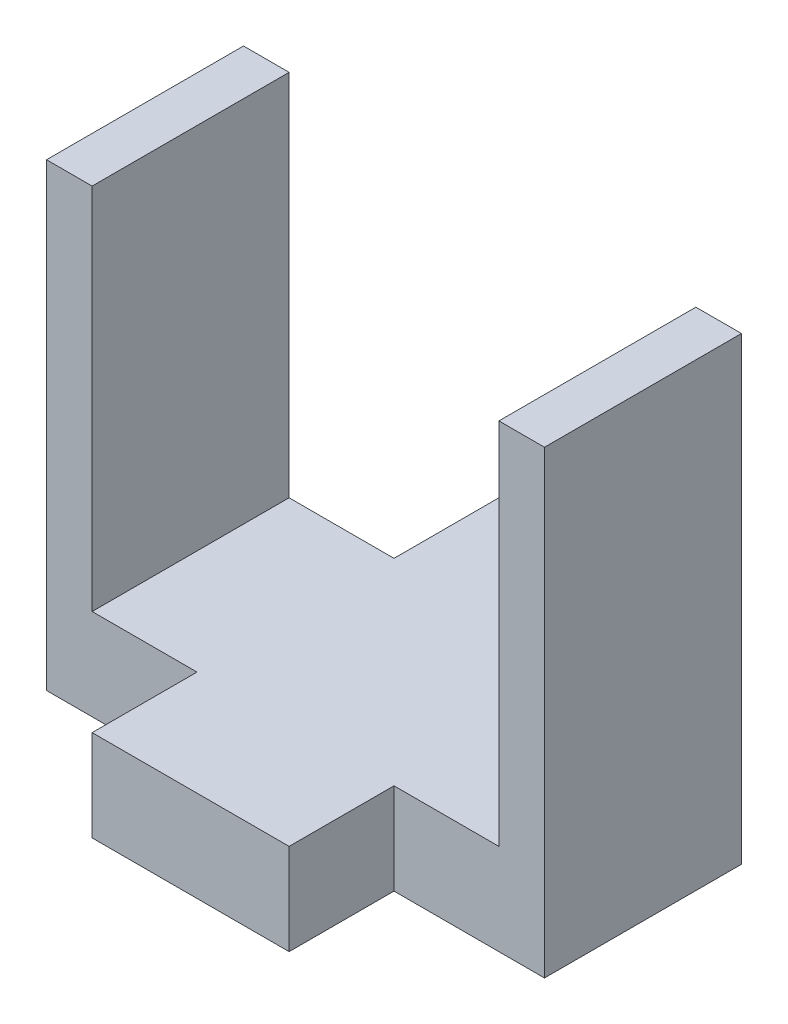
ISO-10303-21;
HEADER;
FILE_DESCRIPTION(('STEP AP214'),'2;1');
FILE_NAME('part.step','',(''),(''),'','','');
FILE_SCHEMA(('AUTOMOTIVE_DESIGN { 1 0 10303 214 1 1 1 1 }'));
ENDSEC;
DATA;
#1=APPLICATION_CONTEXT('core data for automotive mechanical design processes');
#2=APPLICATION_PROTOCOL_DEFINITION('international standard','automotive_design',2000,#1);
#3=PRODUCT_CONTEXT('',#1,'mechanical');
#4=PRODUCT('Part','Part','',(#3));
#5=PRODUCT_RELATED_PRODUCT_CATEGORY('part','',(#4));
#6=PRODUCT_DEFINITION_FORMATION('','',#4);
#7=PRODUCT_DEFINITION_CONTEXT('part definition',#1,'design');
#8=PRODUCT_DEFINITION('design','',#6,#7);
#9=PRODUCT_DEFINITION_SHAPE('','',#8);
#10=(LENGTH_UNIT() NAMED_UNIT(*) SI_UNIT(.MILLI.,.METRE.));
#11=(NAMED_UNIT(*) PLANE_ANGLE_UNIT() SI_UNIT($,.RADIAN.));
#12=(NAMED_UNIT(*) SI_UNIT($,.STERADIAN.) SOLID_ANGLE_UNIT());
#13=UNCERTAINTY_MEASURE_WITH_UNIT(LENGTH_MEASURE(1.E-05),#10,'distance_accuracy_value','');
#14=(GEOMETRIC_REPRESENTATION_CONTEXT(3) GLOBAL_UNCERTAINTY_ASSIGNED_CONTEXT((#13)) GLOBAL_UNIT_ASSIGNED_CONTEXT((#10,
#11,#12)) REPRESENTATION_CONTEXT('',''));
#15=CARTESIAN_POINT('',(0.,0.,0.));
#16=DIRECTION('',(0.,0.,1.));
#17=DIRECTION('',(1.,0.,0.));
#18=AXIS2_PLACEMENT_3D('',#15,#16,#17);
#19=CARTESIAN_POINT('',(10.8,10.,-10.8));
#20=DIRECTION('',(0.,0.,1.));
#21=DIRECTION('',(1.,0.,0.));
#22=AXIS2_PLACEMENT_3D('',#19,#20,#21);
#23=PLANE('',#22);
#24=DIRECTION('',(-1.,0.,0.));
#25=VECTOR('',#24,1.);
#26=CARTESIAN_POINT('',(10.8,0.,-10.8));
#27=LINE('',#26,#25);
#28=CARTESIAN_POINT('',(27.3,0.,-10.8));
#29=VERTEX_POINT('',#28);
#30=CARTESIAN_POINT('',(10.8,0.,-10.8));
#31=VERTEX_POINT('',#30);
#32=EDGE_CURVE('E147',#29,#31,#27,.T.);
#33=ORIENTED_EDGE('',*,*,#32,.T.);
#34=DIRECTION('',(0.,-1.,0.));
#35=VECTOR('',#34,1.);
#36=CARTESIAN_POINT('',(10.8,10.,-10.8));
#37=LINE('',#36,#35);
#38=CARTESIAN_POINT('',(10.8,10.,-10.8));
#39=VERTEX_POINT('',#38);
#40=EDGE_CURVE('E11',#39,#31,#37,.T.);
#41=ORIENTED_EDGE('',*,*,#40,.F.);
#42=DIRECTION('',(-1.,0.,0.));
#43=VECTOR('',#42,1.);
#44=CARTESIAN_POINT('',(10.8,10.,-10.8));
#45=LINE('',#44,#43);
#46=CARTESIAN_POINT('',(22.3,10.,-10.8));
#47=VERTEX_POINT('',#46);
#48=EDGE_CURVE('E168',#47,#39,#45,.T.);
#49=ORIENTED_EDGE('',*,*,#48,.F.);
#50=DIRECTION('',(0.,-1.,0.));
#51=VECTOR('',#50,1.);
#52=CARTESIAN_POINT('',(22.3,50.4,-10.8));
#53=LINE('',#52,#51);
#54=CARTESIAN_POINT('',(22.3,50.4,-10.8));
#55=VERTEX_POINT('',#54);
#56=EDGE_CURVE('E55',#55,#47,#53,.T.);
#57=ORIENTED_EDGE('',*,*,#56,.F.);
#58=DIRECTION('',(-1.,0.,0.));
#59=VECTOR('',#58,1.);
#60=CARTESIAN_POINT('',(22.3,50.4,-10.8));
#61=LINE('',#60,#59);
#62=CARTESIAN_POINT('',(27.3,50.4,-10.8));
#63=VERTEX_POINT('',#62);
#64=EDGE_CURVE('E334',#63,#55,#61,.T.);
#65=ORIENTED_EDGE('',*,*,#64,.F.);
#66=DIRECTION('',(0.,-1.,0.));
#67=VECTOR('',#66,1.);
#68=CARTESIAN_POINT('',(27.3,50.4,-10.8));
#69=LINE('',#68,#67);
#70=EDGE_CURVE('E251',#63,#29,#69,.T.);
#71=ORIENTED_EDGE('',*,*,#70,.T.);
#72=EDGE_LOOP('',(#33,#41,#49,#57,#65,#71));
#73=FACE_BOUND('',#72,.T.);
#74=ADVANCED_FACE('F39',(#73),#23,.F.);
#75=CARTESIAN_POINT('',(10.8,10.,-22.3));
#76=DIRECTION('',(-1.,0.,0.));
#77=DIRECTION('',(0.,0.,1.));
#78=AXIS2_PLACEMENT_3D('',#75,#76,#77);
#79=PLANE('',#78);
#80=DIRECTION('',(0.,0.,-1.));
#81=VECTOR('',#80,1.);
#82=CARTESIAN_POINT('',(10.8,0.,-22.3));
#83=LINE('',#82,#81);
#84=CARTESIAN_POINT('',(10.8,0.,-22.3));
#85=VERTEX_POINT('',#84);
#86=EDGE_CURVE('E150',#31,#85,#83,.T.);
#87=ORIENTED_EDGE('',*,*,#86,.T.);
#88=DIRECTION('',(0.,-1.,0.));
#89=VECTOR('',#88,1.);
#90=CARTESIAN_POINT('',(10.8,10.,-22.3));
#91=LINE('',#90,#89);
#92=CARTESIAN_POINT('',(10.8,10.,-22.3));
#93=VERTEX_POINT('',#92);
#94=EDGE_CURVE('E47',#93,#85,#91,.T.);
#95=ORIENTED_EDGE('',*,*,#94,.F.);
#96=DIRECTION('',(0.,0.,-1.));
#97=VECTOR('',#96,1.);
#98=CARTESIAN_POINT('',(10.8,10.,-22.3));
#99=LINE('',#98,#97);
#100=EDGE_CURVE('E101',#39,#93,#99,.T.);
#101=ORIENTED_EDGE('',*,*,#100,.F.);
#102=ORIENTED_EDGE('',*,*,#40,.T.);
#103=EDGE_LOOP('',(#87,#95,#101,#102));
#104=FACE_BOUND('',#103,.T.);
#105=ADVANCED_FACE('F263',(#104),#79,.F.);
#106=CARTESIAN_POINT('',(-10.8,10.,-22.3));
#107=DIRECTION('',(0.,0.,1.));
#108=DIRECTION('',(1.,0.,0.));
#109=AXIS2_PLACEMENT_3D('',#106,#107,#108);
#110=PLANE('',#109);
#111=DIRECTION('',(-1.,0.,0.));
#112=VECTOR('',#111,1.);
#113=CARTESIAN_POINT('',(-10.8,0.,-22.3));
#114=LINE('',#113,#112);
#115=CARTESIAN_POINT('',(-10.8,0.,-22.3));
#116=VERTEX_POINT('',#115);
#117=EDGE_CURVE('E152',#85,#116,#114,.T.);
#118=ORIENTED_EDGE('',*,*,#117,.T.);
#119=DIRECTION('',(0.,-1.,0.));
#120=VECTOR('',#119,1.);
#121=CARTESIAN_POINT('',(-10.8,10.,-22.3));
#122=LINE('',#121,#120);
#123=CARTESIAN_POINT('',(-10.8,10.,-22.3));
#124=VERTEX_POINT('',#123);
#125=EDGE_CURVE('E177',#124,#116,#122,.T.);
#126=ORIENTED_EDGE('',*,*,#125,.F.);
#127=DIRECTION('',(-1.,0.,0.));
#128=VECTOR('',#127,1.);
#129=CARTESIAN_POINT('',(-10.8,10.,-22.3));
#130=LINE('',#129,#128);
#131=EDGE_CURVE('E185',#93,#124,#130,.T.);
#132=ORIENTED_EDGE('',*,*,#131,.F.);
#133=ORIENTED_EDGE('',*,*,#94,.T.);
#134=EDGE_LOOP('',(#118,#126,#132,#133));
#135=FACE_BOUND('',#134,.T.);
#136=ADVANCED_FACE('F183',(#135),#110,.F.);
#137=CARTESIAN_POINT('',(-10.8,10.,-22.3));
#138=DIRECTION('',(1.,0.,0.));
#139=DIRECTION('',(0.,0.,-1.));
#140=AXIS2_PLACEMENT_3D('',#137,#138,#139);
#141=PLANE('',#140);
#142=DIRECTION('',(0.,0.,1.));
#143=VECTOR('',#142,1.);
#144=CARTESIAN_POINT('',(-10.8,0.,-22.3));
#145=LINE('',#144,#143);
#146=CARTESIAN_POINT('',(-10.8,0.,-10.8));
#147=VERTEX_POINT('',#146);
#148=EDGE_CURVE('E154',#116,#147,#145,.T.);
#149=ORIENTED_EDGE('',*,*,#148,.T.);
#150=DIRECTION('',(0.,-1.,0.));
#151=VECTOR('',#150,1.);
#152=CARTESIAN_POINT('',(-10.8,10.,-10.8));
#153=LINE('',#152,#151);
#154=CARTESIAN_POINT('',(-10.8,10.,-10.8));
#155=VERTEX_POINT('',#154);
#156=EDGE_CURVE('E174',#155,#147,#153,.T.);
#157=ORIENTED_EDGE('',*,*,#156,.F.);
#158=DIRECTION('',(0.,0.,1.));
#159=VECTOR('',#158,1.);
#160=CARTESIAN_POINT('',(-10.8,10.,-22.3));
#161=LINE('',#160,#159);
#162=EDGE_CURVE('E211',#124,#155,#161,.T.);
#163=ORIENTED_EDGE('',*,*,#162,.F.);
#164=ORIENTED_EDGE('',*,*,#125,.T.);
#165=EDGE_LOOP('',(#149,#157,#163,#164));
#166=FACE_BOUND('',#165,.T.);
#167=ADVANCED_FACE('F194',(#166),#141,.F.);
#168=CARTESIAN_POINT('',(-10.8,10.,-10.8));
#169=DIRECTION('',(0.,0.,1.));
#170=DIRECTION('',(1.,0.,0.));
#171=AXIS2_PLACEMENT_3D('',#168,#169,#170);
#172=PLANE('',#171);
#173=DIRECTION('',(-1.,0.,0.));
#174=VECTOR('',#173,1.);
#175=CARTESIAN_POINT('',(-10.8,0.,-10.8));
#176=LINE('',#175,#174);
#177=CARTESIAN_POINT('',(-27.3,0.,-10.8));
#178=VERTEX_POINT('',#177);
#179=EDGE_CURVE('E156',#147,#178,#176,.T.);
#180=ORIENTED_EDGE('',*,*,#179,.T.);
#181=DIRECTION('',(0.,-1.,0.));
#182=VECTOR('',#181,1.);
#183=CARTESIAN_POINT('',(-27.3,50.4,-10.8));
#184=LINE('',#183,#182);
#185=CARTESIAN_POINT('',(-27.3,50.4,-10.8));
#186=VERTEX_POINT('',#185);
#187=EDGE_CURVE('E358',#186,#178,#184,.T.);
#188=ORIENTED_EDGE('',*,*,#187,.F.);
#189=DIRECTION('',(-1.,0.,0.));
#190=VECTOR('',#189,1.);
#191=CARTESIAN_POINT('',(-22.3,50.4,-10.8));
#192=LINE('',#191,#190);
#193=CARTESIAN_POINT('',(-22.3,50.4,-10.8));
#194=VERTEX_POINT('',#193);
#195=EDGE_CURVE('E343',#194,#186,#192,.T.);
#196=ORIENTED_EDGE('',*,*,#195,.F.);
#197=DIRECTION('',(0.,-1.,0.));
#198=VECTOR('',#197,1.);
#199=CARTESIAN_POINT('',(-22.3,50.4,-10.8));
#200=LINE('',#199,#198);
#201=CARTESIAN_POINT('',(-22.3,10.,-10.8));
#202=VERTEX_POINT('',#201);
#203=EDGE_CURVE('E208',#194,#202,#200,.T.);
#204=ORIENTED_EDGE('',*,*,#203,.T.);
#205=DIRECTION('',(-1.,0.,0.));
#206=VECTOR('',#205,1.);
#207=CARTESIAN_POINT('',(-10.8,10.,-10.8));
#208=LINE('',#207,#206);
#209=EDGE_CURVE('E204',#155,#202,#208,.T.);
#210=ORIENTED_EDGE('',*,*,#209,.F.);
#211=ORIENTED_EDGE('',*,*,#156,.T.);
#212=EDGE_LOOP('',(#180,#188,#196,#204,#210,#211));
#213=FACE_BOUND('',#212,.T.);
#214=ADVANCED_FACE('F198',(#213),#172,.F.);
#215=CARTESIAN_POINT('',(-10.8,10.,10.8));
#216=DIRECTION('',(0.,0.,-1.));
#217=DIRECTION('',(-1.,0.,0.));
#218=AXIS2_PLACEMENT_3D('',#215,#216,#217);
#219=PLANE('',#218);
#220=DIRECTION('',(1.,0.,0.));
#221=VECTOR('',#220,1.);
#222=CARTESIAN_POINT('',(-10.8,0.,10.8));
#223=LINE('',#222,#221);
#224=CARTESIAN_POINT('',(-27.3,0.,10.8));
#225=VERTEX_POINT('',#224);
#226=CARTESIAN_POINT('',(-10.8,0.,10.8));
#227=VERTEX_POINT('',#226);
#228=EDGE_CURVE('E159',#225,#227,#223,.T.);
#229=ORIENTED_EDGE('',*,*,#228,.T.);
#230=DIRECTION('',(0.,-1.,0.));
#231=VECTOR('',#230,1.);
#232=CARTESIAN_POINT('',(-10.8,10.,10.8));
#233=LINE('',#232,#231);
#234=CARTESIAN_POINT('',(-10.8,10.,10.8));
#235=VERTEX_POINT('',#234);
#236=EDGE_CURVE('E171',#235,#227,#233,.T.);
#237=ORIENTED_EDGE('',*,*,#236,.F.);
#238=DIRECTION('',(1.,0.,0.));
#239=VECTOR('',#238,1.);
#240=CARTESIAN_POINT('',(-10.8,10.,10.8));
#241=LINE('',#240,#239);
#242=CARTESIAN_POINT('',(-22.3,10.,10.8));
#243=VERTEX_POINT('',#242);
#244=EDGE_CURVE('E213',#243,#235,#241,.T.);
#245=ORIENTED_EDGE('',*,*,#244,.F.);
#246=DIRECTION('',(0.,-1.,0.));
#247=VECTOR('',#246,1.);
#248=CARTESIAN_POINT('',(-22.3,50.4,10.8));
#249=LINE('',#248,#247);
#250=CARTESIAN_POINT('',(-22.3,50.4,10.8));
#251=VERTEX_POINT('',#250);
#252=EDGE_CURVE('E313',#251,#243,#249,.T.);
#253=ORIENTED_EDGE('',*,*,#252,.F.);
#254=DIRECTION('',(1.,0.,0.));
#255=VECTOR('',#254,1.);
#256=CARTESIAN_POINT('',(-22.3,50.4,10.8));
#257=LINE('',#256,#255);
#258=CARTESIAN_POINT('',(-27.3,50.4,10.8));
#259=VERTEX_POINT('',#258);
#260=EDGE_CURVE('E348',#259,#251,#257,.T.);
#261=ORIENTED_EDGE('',*,*,#260,.F.);
#262=DIRECTION('',(0.,-1.,0.));
#263=VECTOR('',#262,1.);
#264=CARTESIAN_POINT('',(-27.3,50.4,10.8));
#265=LINE('',#264,#263);
#266=EDGE_CURVE('E359',#259,#225,#265,.T.);
#267=ORIENTED_EDGE('',*,*,#266,.T.);
#268=EDGE_LOOP('',(#229,#237,#245,#253,#261,#267));
#269=FACE_BOUND('',#268,.T.);
#270=ADVANCED_FACE('F223',(#269),#219,.F.);
#271=CARTESIAN_POINT('',(-10.8,10.,22.3));
#272=DIRECTION('',(1.,0.,0.));
#273=DIRECTION('',(0.,0.,-1.));
#274=AXIS2_PLACEMENT_3D('',#271,#272,#273);
#275=PLANE('',#274);
#276=DIRECTION('',(0.,0.,1.));
#277=VECTOR('',#276,1.);
#278=CARTESIAN_POINT('',(-10.8,0.,22.3));
#279=LINE('',#278,#277);
#280=CARTESIAN_POINT('',(-10.8,0.,22.3));
#281=VERTEX_POINT('',#280);
#282=EDGE_CURVE('E161',#227,#281,#279,.T.);
#283=ORIENTED_EDGE('',*,*,#282,.T.);
#284=DIRECTION('',(0.,-1.,0.));
#285=VECTOR('',#284,1.);
#286=CARTESIAN_POINT('',(-10.8,10.,22.3));
#287=LINE('',#286,#285);
#288=CARTESIAN_POINT('',(-10.8,10.,22.3));
#289=VERTEX_POINT('',#288);
#290=EDGE_CURVE('E135',#289,#281,#287,.T.);
#291=ORIENTED_EDGE('',*,*,#290,.F.);
#292=DIRECTION('',(0.,0.,1.));
#293=VECTOR('',#292,1.);
#294=CARTESIAN_POINT('',(-10.8,10.,22.3));
#295=LINE('',#294,#293);
#296=EDGE_CURVE('E130',#235,#289,#295,.T.);
#297=ORIENTED_EDGE('',*,*,#296,.F.);
#298=ORIENTED_EDGE('',*,*,#236,.T.);
#299=EDGE_LOOP('',(#283,#291,#297,#298));
#300=FACE_BOUND('',#299,.T.);
#301=ADVANCED_FACE('F228',(#300),#275,.F.);
#302=CARTESIAN_POINT('',(-10.8,10.,22.3));
#303=DIRECTION('',(0.,0.,-1.));
#304=DIRECTION('',(-1.,0.,0.));
#305=AXIS2_PLACEMENT_3D('',#302,#303,#304);
#306=PLANE('',#305);
#307=DIRECTION('',(1.,0.,0.));
#308=VECTOR('',#307,1.);
#309=CARTESIAN_POINT('',(-10.8,0.,22.3));
#310=LINE('',#309,#308);
#311=CARTESIAN_POINT('',(10.8,0.,22.3));
#312=VERTEX_POINT('',#311);
#313=EDGE_CURVE('E86',#281,#312,#310,.T.);
#314=ORIENTED_EDGE('',*,*,#313,.T.);
#315=DIRECTION('',(0.,-1.,0.));
#316=VECTOR('',#315,1.);
#317=CARTESIAN_POINT('',(10.8,10.,22.3));
#318=LINE('',#317,#316);
#319=CARTESIAN_POINT('',(10.8,10.,22.3));
#320=VERTEX_POINT('',#319);
#321=EDGE_CURVE('E133',#320,#312,#318,.T.);
#322=ORIENTED_EDGE('',*,*,#321,.F.);
#323=DIRECTION('',(1.,0.,0.));
#324=VECTOR('',#323,1.);
#325=CARTESIAN_POINT('',(-10.8,10.,22.3));
#326=LINE('',#325,#324);
#327=EDGE_CURVE('E124',#289,#320,#326,.T.);
#328=ORIENTED_EDGE('',*,*,#327,.F.);
#329=ORIENTED_EDGE('',*,*,#290,.T.);
#330=EDGE_LOOP('',(#314,#322,#328,#329));
#331=FACE_BOUND('',#330,.T.);
#332=ADVANCED_FACE('F134',(#331),#306,.F.);
#333=CARTESIAN_POINT('',(10.8,10.,22.3));
#334=DIRECTION('',(-1.,0.,0.));
#335=DIRECTION('',(0.,0.,1.));
#336=AXIS2_PLACEMENT_3D('',#333,#334,#335);
#337=PLANE('',#336);
#338=DIRECTION('',(0.,0.,-1.));
#339=VECTOR('',#338,1.);
#340=CARTESIAN_POINT('',(10.8,0.,22.3));
#341=LINE('',#340,#339);
#342=CARTESIAN_POINT('',(10.8,0.,10.8));
#343=VERTEX_POINT('',#342);
#344=EDGE_CURVE('E93',#312,#343,#341,.T.);
#345=ORIENTED_EDGE('',*,*,#344,.T.);
#346=DIRECTION('',(0.,-1.,0.));
#347=VECTOR('',#346,1.);
#348=CARTESIAN_POINT('',(10.8,10.,10.8));
#349=LINE('',#348,#347);
#350=CARTESIAN_POINT('',(10.8,10.,10.8));
#351=VERTEX_POINT('',#350);
#352=EDGE_CURVE('E136',#351,#343,#349,.T.);
#353=ORIENTED_EDGE('',*,*,#352,.F.);
#354=DIRECTION('',(0.,0.,-1.));
#355=VECTOR('',#354,1.);
#356=CARTESIAN_POINT('',(10.8,10.,22.3));
#357=LINE('',#356,#355);
#358=EDGE_CURVE('E128',#320,#351,#357,.T.);
#359=ORIENTED_EDGE('',*,*,#358,.F.);
#360=ORIENTED_EDGE('',*,*,#321,.T.);
#361=EDGE_LOOP('',(#345,#353,#359,#360));
#362=FACE_BOUND('',#361,.T.);
#363=ADVANCED_FACE('F138',(#362),#337,.F.);
#364=CARTESIAN_POINT('',(10.8,10.,10.8));
#365=DIRECTION('',(0.,0.,-1.));
#366=DIRECTION('',(-1.,0.,0.));
#367=AXIS2_PLACEMENT_3D('',#364,#365,#366);
#368=PLANE('',#367);
#369=DIRECTION('',(1.,0.,0.));
#370=VECTOR('',#369,1.);
#371=CARTESIAN_POINT('',(10.8,0.,10.8));
#372=LINE('',#371,#370);
#373=CARTESIAN_POINT('',(27.3,0.,10.8));
#374=VERTEX_POINT('',#373);
#375=EDGE_CURVE('E165',#343,#374,#372,.T.);
#376=ORIENTED_EDGE('',*,*,#375,.T.);
#377=DIRECTION('',(0.,-1.,0.));
#378=VECTOR('',#377,1.);
#379=CARTESIAN_POINT('',(27.3,50.4,10.8));
#380=LINE('',#379,#378);
#381=CARTESIAN_POINT('',(27.3,50.4,10.8));
#382=VERTEX_POINT('',#381);
#383=EDGE_CURVE('E240',#382,#374,#380,.T.);
#384=ORIENTED_EDGE('',*,*,#383,.F.);
#385=DIRECTION('',(1.,0.,0.));
#386=VECTOR('',#385,1.);
#387=CARTESIAN_POINT('',(22.3,50.4,10.8));
#388=LINE('',#387,#386);
#389=CARTESIAN_POINT('',(22.3,50.4,10.8));
#390=VERTEX_POINT('',#389);
#391=EDGE_CURVE('E330',#390,#382,#388,.T.);
#392=ORIENTED_EDGE('',*,*,#391,.F.);
#393=DIRECTION('',(0.,-1.,0.));
#394=VECTOR('',#393,1.);
#395=CARTESIAN_POINT('',(22.3,50.4,10.8));
#396=LINE('',#395,#394);
#397=CARTESIAN_POINT('',(22.3,10.,10.8));
#398=VERTEX_POINT('',#397);
#399=EDGE_CURVE('E250',#390,#398,#396,.T.);
#400=ORIENTED_EDGE('',*,*,#399,.T.);
#401=DIRECTION('',(1.,0.,0.));
#402=VECTOR('',#401,1.);
#403=CARTESIAN_POINT('',(10.8,10.,10.8));
#404=LINE('',#403,#402);
#405=EDGE_CURVE('E140',#351,#398,#404,.T.);
#406=ORIENTED_EDGE('',*,*,#405,.F.);
#407=ORIENTED_EDGE('',*,*,#352,.T.);
#408=EDGE_LOOP('',(#376,#384,#392,#400,#406,#407));
#409=FACE_BOUND('',#408,.T.);
#410=ADVANCED_FACE('F237',(#409),#368,.F.);
#411=CARTESIAN_POINT('',(0.,10.,0.));
#412=DIRECTION('',(0.,-1.,0.));
#413=DIRECTION('',(0.,0.,-1.));
#414=AXIS2_PLACEMENT_3D('',#411,#412,#413);
#415=PLANE('',#414);
#416=ORIENTED_EDGE('',*,*,#48,.T.);
#417=ORIENTED_EDGE('',*,*,#100,.T.);
#418=ORIENTED_EDGE('',*,*,#131,.T.);
#419=ORIENTED_EDGE('',*,*,#162,.T.);
#420=ORIENTED_EDGE('',*,*,#209,.T.);
#421=DIRECTION('',(0.,0.,1.));
#422=VECTOR('',#421,1.);
#423=CARTESIAN_POINT('',(-22.3,10.,-10.8));
#424=LINE('',#423,#422);
#425=EDGE_CURVE('E210',#202,#243,#424,.T.);
#426=ORIENTED_EDGE('',*,*,#425,.T.);
#427=ORIENTED_EDGE('',*,*,#244,.T.);
#428=ORIENTED_EDGE('',*,*,#296,.T.);
#429=ORIENTED_EDGE('',*,*,#327,.T.);
#430=ORIENTED_EDGE('',*,*,#358,.T.);
#431=ORIENTED_EDGE('',*,*,#405,.T.);
#432=DIRECTION('',(0.,0.,-1.));
#433=VECTOR('',#432,1.);
#434=CARTESIAN_POINT('',(22.3,10.,-10.8));
#435=LINE('',#434,#433);
#436=EDGE_CURVE('E142',#398,#47,#435,.T.);
#437=ORIENTED_EDGE('',*,*,#436,.T.);
#438=EDGE_LOOP('',(#416,#417,#418,#419,#420,#426,#427,#428,#429,#430,#431,#437));
#439=FACE_BOUND('',#438,.T.);
#440=ADVANCED_FACE('F125',(#439),#415,.F.);
#441=CARTESIAN_POINT('',(0.,0.,0.));
#442=DIRECTION('',(0.,-1.,0.));
#443=DIRECTION('',(0.,0.,-1.));
#444=AXIS2_PLACEMENT_3D('',#441,#442,#443);
#445=PLANE('',#444);
#446=ORIENTED_EDGE('',*,*,#32,.F.);
#447=DIRECTION('',(0.,0.,-1.));
#448=VECTOR('',#447,1.);
#449=CARTESIAN_POINT('',(27.3,0.,-10.8));
#450=LINE('',#449,#448);
#451=EDGE_CURVE('E233',#374,#29,#450,.T.);
#452=ORIENTED_EDGE('',*,*,#451,.F.);
#453=ORIENTED_EDGE('',*,*,#375,.F.);
#454=ORIENTED_EDGE('',*,*,#344,.F.);
#455=ORIENTED_EDGE('',*,*,#313,.F.);
#456=ORIENTED_EDGE('',*,*,#282,.F.);
#457=ORIENTED_EDGE('',*,*,#228,.F.);
#458=DIRECTION('',(0.,0.,1.));
#459=VECTOR('',#458,1.);
#460=CARTESIAN_POINT('',(-27.3,0.,-10.8));
#461=LINE('',#460,#459);
#462=EDGE_CURVE('E337',#178,#225,#461,.T.);
#463=ORIENTED_EDGE('',*,*,#462,.F.);
#464=ORIENTED_EDGE('',*,*,#179,.F.);
#465=ORIENTED_EDGE('',*,*,#148,.F.);
#466=ORIENTED_EDGE('',*,*,#117,.F.);
#467=ORIENTED_EDGE('',*,*,#86,.F.);
#468=EDGE_LOOP('',(#446,#452,#453,#454,#455,#456,#457,#463,#464,#465,#466,#467));
#469=FACE_BOUND('',#468,.T.);
#470=ADVANCED_FACE('F189',(#469),#445,.T.);
#471=CARTESIAN_POINT('',(22.3,50.4,-10.8));
#472=DIRECTION('',(1.,0.,0.));
#473=DIRECTION('',(0.,0.,-1.));
#474=AXIS2_PLACEMENT_3D('',#471,#472,#473);
#475=PLANE('',#474);
#476=ORIENTED_EDGE('',*,*,#436,.F.);
#477=ORIENTED_EDGE('',*,*,#399,.F.);
#478=DIRECTION('',(0.,0.,1.));
#479=VECTOR('',#478,1.);
#480=CARTESIAN_POINT('',(22.3,50.4,-10.8));
#481=LINE('',#480,#479);
#482=EDGE_CURVE('E331',#55,#390,#481,.T.);
#483=ORIENTED_EDGE('',*,*,#482,.F.);
#484=ORIENTED_EDGE('',*,*,#56,.T.);
#485=EDGE_LOOP('',(#476,#477,#483,#484));
#486=FACE_BOUND('',#485,.T.);
#487=ADVANCED_FACE('F287',(#486),#475,.F.);
#488=CARTESIAN_POINT('',(27.3,50.4,-10.8));
#489=DIRECTION('',(-1.,0.,0.));
#490=DIRECTION('',(0.,0.,1.));
#491=AXIS2_PLACEMENT_3D('',#488,#489,#490);
#492=PLANE('',#491);
#493=ORIENTED_EDGE('',*,*,#451,.T.);
#494=ORIENTED_EDGE('',*,*,#70,.F.);
#495=DIRECTION('',(0.,0.,-1.));
#496=VECTOR('',#495,1.);
#497=CARTESIAN_POINT('',(27.3,50.4,-10.8));
#498=LINE('',#497,#496);
#499=EDGE_CURVE('E249',#382,#63,#498,.T.);
#500=ORIENTED_EDGE('',*,*,#499,.F.);
#501=ORIENTED_EDGE('',*,*,#383,.T.);
#502=EDGE_LOOP('',(#493,#494,#500,#501));
#503=FACE_BOUND('',#502,.T.);
#504=ADVANCED_FACE('F245',(#503),#492,.F.);
#505=CARTESIAN_POINT('',(0.,50.4,0.));
#506=DIRECTION('',(0.,-1.,0.));
#507=DIRECTION('',(0.,0.,-1.));
#508=AXIS2_PLACEMENT_3D('',#505,#506,#507);
#509=PLANE('',#508);
#510=ORIENTED_EDGE('',*,*,#64,.T.);
#511=ORIENTED_EDGE('',*,*,#482,.T.);
#512=ORIENTED_EDGE('',*,*,#391,.T.);
#513=ORIENTED_EDGE('',*,*,#499,.T.);
#514=EDGE_LOOP('',(#510,#511,#512,#513));
#515=FACE_BOUND('',#514,.T.);
#516=ADVANCED_FACE('F294',(#515),#509,.F.);
#517=CARTESIAN_POINT('',(-22.3,50.4,-10.8));
#518=DIRECTION('',(-1.,0.,0.));
#519=DIRECTION('',(0.,0.,1.));
#520=AXIS2_PLACEMENT_3D('',#517,#518,#519);
#521=PLANE('',#520);
#522=ORIENTED_EDGE('',*,*,#425,.F.);
#523=ORIENTED_EDGE('',*,*,#203,.F.);
#524=DIRECTION('',(0.,0.,-1.));
#525=VECTOR('',#524,1.);
#526=CARTESIAN_POINT('',(-22.3,50.4,-10.8));
#527=LINE('',#526,#525);
#528=EDGE_CURVE('E339',#251,#194,#527,.T.);
#529=ORIENTED_EDGE('',*,*,#528,.F.);
#530=ORIENTED_EDGE('',*,*,#252,.T.);
#531=EDGE_LOOP('',(#522,#523,#529,#530));
#532=FACE_BOUND('',#531,.T.);
#533=ADVANCED_FACE('F297',(#532),#521,.F.);
#534=CARTESIAN_POINT('',(-27.3,50.4,-10.8));
#535=DIRECTION('',(1.,0.,0.));
#536=DIRECTION('',(0.,0.,-1.));
#537=AXIS2_PLACEMENT_3D('',#534,#535,#536);
#538=PLANE('',#537);
#539=ORIENTED_EDGE('',*,*,#462,.T.);
#540=ORIENTED_EDGE('',*,*,#266,.F.);
#541=DIRECTION('',(0.,0.,1.));
#542=VECTOR('',#541,1.);
#543=CARTESIAN_POINT('',(-27.3,50.4,-10.8));
#544=LINE('',#543,#542);
#545=EDGE_CURVE('E351',#186,#259,#544,.T.);
#546=ORIENTED_EDGE('',*,*,#545,.F.);
#547=ORIENTED_EDGE('',*,*,#187,.T.);
#548=EDGE_LOOP('',(#539,#540,#546,#547));
#549=FACE_BOUND('',#548,.T.);
#550=ADVANCED_FACE('F302',(#549),#538,.F.);
#551=CARTESIAN_POINT('',(0.,50.4,0.));
#552=DIRECTION('',(0.,-1.,0.));
#553=DIRECTION('',(0.,0.,-1.));
#554=AXIS2_PLACEMENT_3D('',#551,#552,#553);
#555=PLANE('',#554);
#556=ORIENTED_EDGE('',*,*,#528,.T.);
#557=ORIENTED_EDGE('',*,*,#195,.T.);
#558=ORIENTED_EDGE('',*,*,#545,.T.);
#559=ORIENTED_EDGE('',*,*,#260,.T.);
#560=EDGE_LOOP('',(#556,#557,#558,#559));
#561=FACE_BOUND('',#560,.T.);
#562=ADVANCED_FACE('F299',(#561),#555,.F.);
#563=CLOSED_SHELL('',(#74,#105,#136,#167,#214,#270,#301,#332,#363,#410,#440,#470,#487,#504,#516,
#533,#550,#562));
#564=MANIFOLD_SOLID_BREP('B2',#563);
#565=ADVANCED_BREP_SHAPE_REPRESENTATION('',(#18,#564),#14);
#566=SHAPE_DEFINITION_REPRESENTATION(#9,#565);
ENDSEC;
END-ISO-10303-21;
